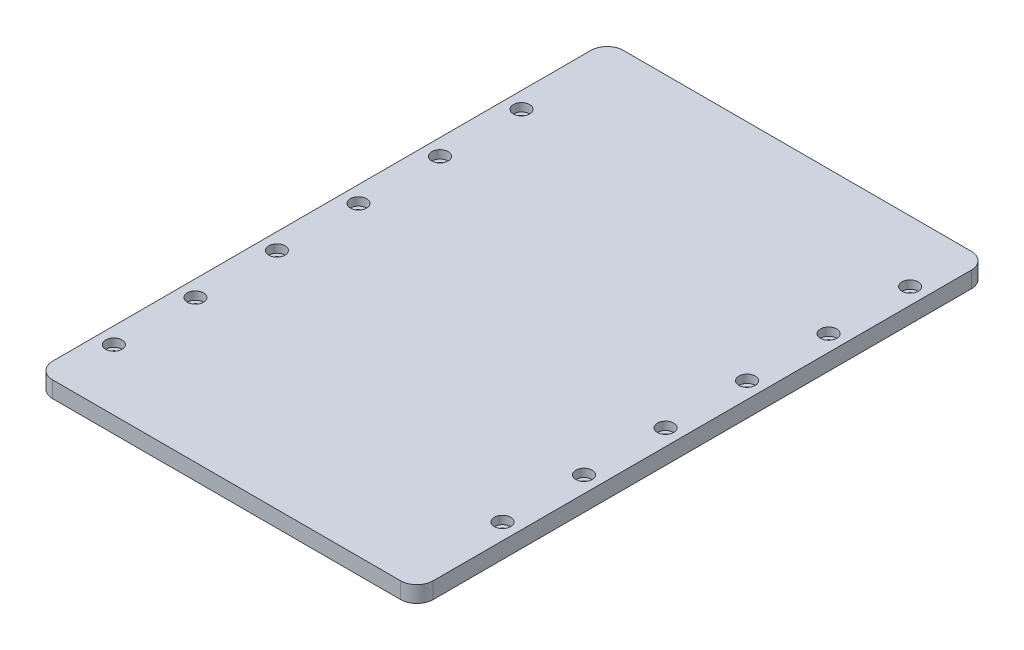
ISO-10303-21;
HEADER;
FILE_DESCRIPTION(('STEP AP214'),'2;1');
FILE_NAME('part.step','',(''),(''),'','','');
FILE_SCHEMA(('AUTOMOTIVE_DESIGN { 1 0 10303 214 1 1 1 1 }'));
ENDSEC;
DATA;
#1=APPLICATION_CONTEXT('core data for automotive mechanical design processes');
#2=APPLICATION_PROTOCOL_DEFINITION('international standard','automotive_design',2000,#1);
#3=PRODUCT_CONTEXT('',#1,'mechanical');
#4=PRODUCT('Part','Part','',(#3));
#5=PRODUCT_RELATED_PRODUCT_CATEGORY('part','',(#4));
#6=PRODUCT_DEFINITION_FORMATION('','',#4);
#7=PRODUCT_DEFINITION_CONTEXT('part definition',#1,'design');
#8=PRODUCT_DEFINITION('design','',#6,#7);
#9=PRODUCT_DEFINITION_SHAPE('','',#8);
#10=(LENGTH_UNIT() NAMED_UNIT(*) SI_UNIT(.MILLI.,.METRE.));
#11=(NAMED_UNIT(*) PLANE_ANGLE_UNIT() SI_UNIT($,.RADIAN.));
#12=(NAMED_UNIT(*) SI_UNIT($,.STERADIAN.) SOLID_ANGLE_UNIT());
#13=UNCERTAINTY_MEASURE_WITH_UNIT(LENGTH_MEASURE(1.E-05),#10,'distance_accuracy_value','');
#14=(GEOMETRIC_REPRESENTATION_CONTEXT(3) GLOBAL_UNCERTAINTY_ASSIGNED_CONTEXT((#13)) GLOBAL_UNIT_ASSIGNED_CONTEXT((#10,
#11,#12)) REPRESENTATION_CONTEXT('',''));
#15=CARTESIAN_POINT('',(0.,0.,0.));
#16=DIRECTION('',(0.,0.,1.));
#17=DIRECTION('',(1.,0.,0.));
#18=AXIS2_PLACEMENT_3D('',#15,#16,#17);
#19=CARTESIAN_POINT('',(63.9999999999998,-4.,7.49999999999999));
#20=DIRECTION('',(0.,1.,0.));
#21=DIRECTION('',(0.,0.,1.));
#22=AXIS2_PLACEMENT_3D('',#19,#20,#21);
#23=CYLINDRICAL_SURFACE('',#22,1.5);
#24=CARTESIAN_POINT('',(63.9999999999998,0.,7.49999999999999));
#25=DIRECTION('',(0.,1.,0.));
#26=DIRECTION('',(0.,0.,1.));
#27=AXIS2_PLACEMENT_3D('',#24,#25,#26);
#28=CIRCLE('',#27,1.5);
#29=CARTESIAN_POINT('',(63.9999999999998,0.,8.99999999999999));
#30=VERTEX_POINT('',#29);
#31=EDGE_CURVE('E162',#30,#30,#28,.T.);
#32=ORIENTED_EDGE('',*,*,#31,.F.);
#33=EDGE_LOOP('',(#32));
#34=FACE_BOUND('',#33,.T.);
#35=CARTESIAN_POINT('',(63.9999999999998,3.,7.49999999999999));
#36=DIRECTION('',(0.,1.,0.));
#37=DIRECTION('',(0.,0.,1.));
#38=AXIS2_PLACEMENT_3D('',#35,#36,#37);
#39=CIRCLE('',#38,1.5);
#40=CARTESIAN_POINT('',(63.9999999999998,3.,8.99999999999999));
#41=VERTEX_POINT('',#40);
#42=EDGE_CURVE('E351',#41,#41,#39,.T.);
#43=ORIENTED_EDGE('',*,*,#42,.T.);
#44=EDGE_LOOP('',(#43));
#45=FACE_BOUND('',#44,.T.);
#46=ADVANCED_FACE('F36',(#34,#45),#23,.F.);
#47=CARTESIAN_POINT('',(63.9999999999999,-4.,37.5));
#48=DIRECTION('',(0.,1.,0.));
#49=DIRECTION('',(0.,0.,1.));
#50=AXIS2_PLACEMENT_3D('',#47,#48,#49);
#51=CYLINDRICAL_SURFACE('',#50,1.5);
#52=CARTESIAN_POINT('',(63.9999999999999,0.,37.5));
#53=DIRECTION('',(0.,1.,0.));
#54=DIRECTION('',(0.,0.,1.));
#55=AXIS2_PLACEMENT_3D('',#52,#53,#54);
#56=CIRCLE('',#55,1.5);
#57=CARTESIAN_POINT('',(63.9999999999999,0.,39.));
#58=VERTEX_POINT('',#57);
#59=EDGE_CURVE('E165',#58,#58,#56,.T.);
#60=ORIENTED_EDGE('',*,*,#59,.F.);
#61=EDGE_LOOP('',(#60));
#62=FACE_BOUND('',#61,.T.);
#63=CARTESIAN_POINT('',(63.9999999999999,3.,37.5));
#64=DIRECTION('',(0.,1.,0.));
#65=DIRECTION('',(0.,0.,1.));
#66=AXIS2_PLACEMENT_3D('',#63,#64,#65);
#67=CIRCLE('',#66,1.5);
#68=CARTESIAN_POINT('',(63.9999999999999,3.,39.));
#69=VERTEX_POINT('',#68);
#70=EDGE_CURVE('E354',#69,#69,#67,.T.);
#71=ORIENTED_EDGE('',*,*,#70,.T.);
#72=EDGE_LOOP('',(#71));
#73=FACE_BOUND('',#72,.T.);
#74=ADVANCED_FACE('F218',(#62,#73),#51,.F.);
#75=CARTESIAN_POINT('',(-64.0000000000005,-4.,-67.5));
#76=DIRECTION('',(0.,1.,0.));
#77=DIRECTION('',(0.,0.,1.));
#78=AXIS2_PLACEMENT_3D('',#75,#76,#77);
#79=CYLINDRICAL_SURFACE('',#78,1.5);
#80=CARTESIAN_POINT('',(-64.0000000000005,0.,-67.5));
#81=DIRECTION('',(0.,1.,0.));
#82=DIRECTION('',(0.,0.,1.));
#83=AXIS2_PLACEMENT_3D('',#80,#81,#82);
#84=CIRCLE('',#83,1.5);
#85=CARTESIAN_POINT('',(-64.0000000000005,0.,-66.));
#86=VERTEX_POINT('',#85);
#87=EDGE_CURVE('E168',#86,#86,#84,.T.);
#88=ORIENTED_EDGE('',*,*,#87,.F.);
#89=EDGE_LOOP('',(#88));
#90=FACE_BOUND('',#89,.T.);
#91=CARTESIAN_POINT('',(-64.0000000000005,3.,-67.5));
#92=DIRECTION('',(0.,1.,0.));
#93=DIRECTION('',(0.,0.,1.));
#94=AXIS2_PLACEMENT_3D('',#91,#92,#93);
#95=CIRCLE('',#94,1.5);
#96=CARTESIAN_POINT('',(-64.0000000000005,3.,-66.));
#97=VERTEX_POINT('',#96);
#98=EDGE_CURVE('E40',#97,#97,#95,.F.);
#99=ORIENTED_EDGE('',*,*,#98,.F.);
#100=EDGE_LOOP('',(#99));
#101=FACE_BOUND('',#100,.T.);
#102=ADVANCED_FACE('F215',(#90,#101),#79,.F.);
#103=CARTESIAN_POINT('',(-64.0000000000004,-4.,-37.5));
#104=DIRECTION('',(0.,1.,0.));
#105=DIRECTION('',(0.,0.,1.));
#106=AXIS2_PLACEMENT_3D('',#103,#104,#105);
#107=CYLINDRICAL_SURFACE('',#106,1.5);
#108=CARTESIAN_POINT('',(-64.0000000000004,0.,-37.5));
#109=DIRECTION('',(0.,1.,0.));
#110=DIRECTION('',(0.,0.,1.));
#111=AXIS2_PLACEMENT_3D('',#108,#109,#110);
#112=CIRCLE('',#111,1.5);
#113=CARTESIAN_POINT('',(-64.0000000000004,0.,-36.));
#114=VERTEX_POINT('',#113);
#115=EDGE_CURVE('E171',#114,#114,#112,.T.);
#116=ORIENTED_EDGE('',*,*,#115,.F.);
#117=EDGE_LOOP('',(#116));
#118=FACE_BOUND('',#117,.T.);
#119=CARTESIAN_POINT('',(-64.0000000000004,3.,-37.5));
#120=DIRECTION('',(0.,1.,0.));
#121=DIRECTION('',(0.,0.,1.));
#122=AXIS2_PLACEMENT_3D('',#119,#120,#121);
#123=CIRCLE('',#122,1.5);
#124=CARTESIAN_POINT('',(-64.0000000000004,3.,-36.));
#125=VERTEX_POINT('',#124);
#126=EDGE_CURVE('E206',#125,#125,#123,.F.);
#127=ORIENTED_EDGE('',*,*,#126,.F.);
#128=EDGE_LOOP('',(#127));
#129=FACE_BOUND('',#128,.T.);
#130=ADVANCED_FACE('F217',(#118,#129),#107,.F.);
#131=CARTESIAN_POINT('',(-64.0000000000003,-4.,-7.50000000000001));
#132=DIRECTION('',(0.,1.,0.));
#133=DIRECTION('',(0.,0.,1.));
#134=AXIS2_PLACEMENT_3D('',#131,#132,#133);
#135=CYLINDRICAL_SURFACE('',#134,1.5);
#136=CARTESIAN_POINT('',(-64.0000000000003,0.,-7.50000000000001));
#137=DIRECTION('',(0.,1.,0.));
#138=DIRECTION('',(0.,0.,1.));
#139=AXIS2_PLACEMENT_3D('',#136,#137,#138);
#140=CIRCLE('',#139,1.5);
#141=CARTESIAN_POINT('',(-64.0000000000003,0.,-6.00000000000001));
#142=VERTEX_POINT('',#141);
#143=EDGE_CURVE('E174',#142,#142,#140,.T.);
#144=ORIENTED_EDGE('',*,*,#143,.F.);
#145=EDGE_LOOP('',(#144));
#146=FACE_BOUND('',#145,.T.);
#147=CARTESIAN_POINT('',(-64.0000000000003,3.,-7.50000000000001));
#148=DIRECTION('',(0.,1.,0.));
#149=DIRECTION('',(0.,0.,1.));
#150=AXIS2_PLACEMENT_3D('',#147,#148,#149);
#151=CIRCLE('',#150,1.5);
#152=CARTESIAN_POINT('',(-64.0000000000003,3.,-6.00000000000001));
#153=VERTEX_POINT('',#152);
#154=EDGE_CURVE('E204',#153,#153,#151,.F.);
#155=ORIENTED_EDGE('',*,*,#154,.F.);
#156=EDGE_LOOP('',(#155));
#157=FACE_BOUND('',#156,.T.);
#158=ADVANCED_FACE('F225',(#146,#157),#135,.F.);
#159=CARTESIAN_POINT('',(-64.0000000000002,-4.,22.5));
#160=DIRECTION('',(0.,1.,0.));
#161=DIRECTION('',(0.,0.,1.));
#162=AXIS2_PLACEMENT_3D('',#159,#160,#161);
#163=CYLINDRICAL_SURFACE('',#162,1.5);
#164=CARTESIAN_POINT('',(-64.0000000000002,0.,22.5));
#165=DIRECTION('',(0.,1.,0.));
#166=DIRECTION('',(0.,0.,1.));
#167=AXIS2_PLACEMENT_3D('',#164,#165,#166);
#168=CIRCLE('',#167,1.5);
#169=CARTESIAN_POINT('',(-64.0000000000002,0.,24.));
#170=VERTEX_POINT('',#169);
#171=EDGE_CURVE('E177',#170,#170,#168,.T.);
#172=ORIENTED_EDGE('',*,*,#171,.F.);
#173=EDGE_LOOP('',(#172));
#174=FACE_BOUND('',#173,.T.);
#175=CARTESIAN_POINT('',(-64.0000000000002,3.,22.5));
#176=DIRECTION('',(0.,1.,0.));
#177=DIRECTION('',(0.,0.,1.));
#178=AXIS2_PLACEMENT_3D('',#175,#176,#177);
#179=CIRCLE('',#178,1.5);
#180=CARTESIAN_POINT('',(-64.0000000000002,3.,24.));
#181=VERTEX_POINT('',#180);
#182=EDGE_CURVE('E200',#181,#181,#179,.F.);
#183=ORIENTED_EDGE('',*,*,#182,.F.);
#184=EDGE_LOOP('',(#183));
#185=FACE_BOUND('',#184,.T.);
#186=ADVANCED_FACE('F248',(#174,#185),#163,.F.);
#187=CARTESIAN_POINT('',(-64.0000000000001,-4.,52.5));
#188=DIRECTION('',(0.,1.,0.));
#189=DIRECTION('',(0.,0.,1.));
#190=AXIS2_PLACEMENT_3D('',#187,#188,#189);
#191=CYLINDRICAL_SURFACE('',#190,1.5);
#192=CARTESIAN_POINT('',(-64.0000000000001,0.,52.5));
#193=DIRECTION('',(0.,1.,0.));
#194=DIRECTION('',(0.,0.,1.));
#195=AXIS2_PLACEMENT_3D('',#192,#193,#194);
#196=CIRCLE('',#195,1.5);
#197=CARTESIAN_POINT('',(-64.0000000000001,0.,54.));
#198=VERTEX_POINT('',#197);
#199=EDGE_CURVE('E180',#198,#198,#196,.T.);
#200=ORIENTED_EDGE('',*,*,#199,.F.);
#201=EDGE_LOOP('',(#200));
#202=FACE_BOUND('',#201,.T.);
#203=CARTESIAN_POINT('',(-64.0000000000001,3.,52.5));
#204=DIRECTION('',(0.,1.,0.));
#205=DIRECTION('',(0.,0.,1.));
#206=AXIS2_PLACEMENT_3D('',#203,#204,#205);
#207=CIRCLE('',#206,1.5);
#208=CARTESIAN_POINT('',(-64.0000000000001,3.,54.));
#209=VERTEX_POINT('',#208);
#210=EDGE_CURVE('E197',#209,#209,#207,.F.);
#211=ORIENTED_EDGE('',*,*,#210,.F.);
#212=EDGE_LOOP('',(#211));
#213=FACE_BOUND('',#212,.T.);
#214=ADVANCED_FACE('F244',(#202,#213),#191,.F.);
#215=CARTESIAN_POINT('',(64.,-4.,67.5));
#216=DIRECTION('',(0.,1.,0.));
#217=DIRECTION('',(0.,0.,1.));
#218=AXIS2_PLACEMENT_3D('',#215,#216,#217);
#219=CYLINDRICAL_SURFACE('',#218,1.5);
#220=CARTESIAN_POINT('',(64.,0.,67.5));
#221=DIRECTION('',(0.,1.,0.));
#222=DIRECTION('',(0.,0.,1.));
#223=AXIS2_PLACEMENT_3D('',#220,#221,#222);
#224=CIRCLE('',#223,1.5);
#225=CARTESIAN_POINT('',(64.,0.,69.));
#226=VERTEX_POINT('',#225);
#227=EDGE_CURVE('E183',#226,#226,#224,.T.);
#228=ORIENTED_EDGE('',*,*,#227,.F.);
#229=EDGE_LOOP('',(#228));
#230=FACE_BOUND('',#229,.T.);
#231=CARTESIAN_POINT('',(64.,3.,67.5));
#232=DIRECTION('',(0.,1.,0.));
#233=DIRECTION('',(0.,0.,1.));
#234=AXIS2_PLACEMENT_3D('',#231,#232,#233);
#235=CIRCLE('',#234,1.5);
#236=CARTESIAN_POINT('',(64.,3.,69.));
#237=VERTEX_POINT('',#236);
#238=EDGE_CURVE('E336',#237,#237,#235,.T.);
#239=ORIENTED_EDGE('',*,*,#238,.T.);
#240=EDGE_LOOP('',(#239));
#241=FACE_BOUND('',#240,.T.);
#242=ADVANCED_FACE('F240',(#230,#241),#219,.F.);
#243=CARTESIAN_POINT('',(63.9999999999997,-4.,-22.5));
#244=DIRECTION('',(0.,1.,0.));
#245=DIRECTION('',(0.,0.,1.));
#246=AXIS2_PLACEMENT_3D('',#243,#244,#245);
#247=CYLINDRICAL_SURFACE('',#246,1.5);
#248=CARTESIAN_POINT('',(63.9999999999997,0.,-22.5));
#249=DIRECTION('',(0.,1.,0.));
#250=DIRECTION('',(0.,0.,1.));
#251=AXIS2_PLACEMENT_3D('',#248,#249,#250);
#252=CIRCLE('',#251,1.5);
#253=CARTESIAN_POINT('',(63.9999999999997,0.,-21.));
#254=VERTEX_POINT('',#253);
#255=EDGE_CURVE('E186',#254,#254,#252,.T.);
#256=ORIENTED_EDGE('',*,*,#255,.F.);
#257=EDGE_LOOP('',(#256));
#258=FACE_BOUND('',#257,.T.);
#259=CARTESIAN_POINT('',(63.9999999999997,3.,-22.5));
#260=DIRECTION('',(0.,1.,0.));
#261=DIRECTION('',(0.,0.,1.));
#262=AXIS2_PLACEMENT_3D('',#259,#260,#261);
#263=CIRCLE('',#262,1.5);
#264=CARTESIAN_POINT('',(63.9999999999997,3.,-21.));
#265=VERTEX_POINT('',#264);
#266=EDGE_CURVE('E381',#265,#265,#263,.T.);
#267=ORIENTED_EDGE('',*,*,#266,.T.);
#268=EDGE_LOOP('',(#267));
#269=FACE_BOUND('',#268,.T.);
#270=ADVANCED_FACE('F243',(#258,#269),#247,.F.);
#271=CARTESIAN_POINT('',(63.9999999999996,-4.,-52.5));
#272=DIRECTION('',(0.,1.,0.));
#273=DIRECTION('',(0.,0.,1.));
#274=AXIS2_PLACEMENT_3D('',#271,#272,#273);
#275=CYLINDRICAL_SURFACE('',#274,1.5);
#276=CARTESIAN_POINT('',(63.9999999999996,0.,-52.5));
#277=DIRECTION('',(0.,1.,0.));
#278=DIRECTION('',(0.,0.,1.));
#279=AXIS2_PLACEMENT_3D('',#276,#277,#278);
#280=CIRCLE('',#279,1.5);
#281=CARTESIAN_POINT('',(63.9999999999996,0.,-51.));
#282=VERTEX_POINT('',#281);
#283=EDGE_CURVE('E189',#282,#282,#280,.T.);
#284=ORIENTED_EDGE('',*,*,#283,.F.);
#285=EDGE_LOOP('',(#284));
#286=FACE_BOUND('',#285,.T.);
#287=CARTESIAN_POINT('',(63.9999999999996,3.,-52.5));
#288=DIRECTION('',(0.,1.,0.));
#289=DIRECTION('',(0.,0.,1.));
#290=AXIS2_PLACEMENT_3D('',#287,#288,#289);
#291=CIRCLE('',#290,1.5);
#292=CARTESIAN_POINT('',(63.9999999999996,3.,-51.));
#293=VERTEX_POINT('',#292);
#294=EDGE_CURVE('E372',#293,#293,#291,.T.);
#295=ORIENTED_EDGE('',*,*,#294,.T.);
#296=EDGE_LOOP('',(#295));
#297=FACE_BOUND('',#296,.T.);
#298=ADVANCED_FACE('F498',(#286,#297),#275,.F.);
#299=CARTESIAN_POINT('',(63.9999999999995,-4.,-82.5));
#300=DIRECTION('',(0.,1.,0.));
#301=DIRECTION('',(0.,0.,1.));
#302=AXIS2_PLACEMENT_3D('',#299,#300,#301);
#303=CYLINDRICAL_SURFACE('',#302,1.5);
#304=CARTESIAN_POINT('',(63.9999999999995,0.,-82.5));
#305=DIRECTION('',(0.,1.,0.));
#306=DIRECTION('',(0.,0.,1.));
#307=AXIS2_PLACEMENT_3D('',#304,#305,#306);
#308=CIRCLE('',#307,1.5);
#309=CARTESIAN_POINT('',(63.9999999999995,0.,-81.));
#310=VERTEX_POINT('',#309);
#311=EDGE_CURVE('E192',#310,#310,#308,.T.);
#312=ORIENTED_EDGE('',*,*,#311,.F.);
#313=EDGE_LOOP('',(#312));
#314=FACE_BOUND('',#313,.T.);
#315=CARTESIAN_POINT('',(63.9999999999995,3.,-82.5));
#316=DIRECTION('',(0.,1.,0.));
#317=DIRECTION('',(0.,0.,1.));
#318=AXIS2_PLACEMENT_3D('',#315,#316,#317);
#319=CIRCLE('',#318,1.5);
#320=CARTESIAN_POINT('',(63.9999999999995,3.,-81.));
#321=VERTEX_POINT('',#320);
#322=EDGE_CURVE('E369',#321,#321,#319,.T.);
#323=ORIENTED_EDGE('',*,*,#322,.T.);
#324=EDGE_LOOP('',(#323));
#325=FACE_BOUND('',#324,.T.);
#326=ADVANCED_FACE('F494',(#314,#325),#303,.F.);
#327=CARTESIAN_POINT('',(-64.,-4.,82.5));
#328=DIRECTION('',(0.,1.,0.));
#329=DIRECTION('',(0.,0.,1.));
#330=AXIS2_PLACEMENT_3D('',#327,#328,#329);
#331=CYLINDRICAL_SURFACE('',#330,1.5);
#332=CARTESIAN_POINT('',(-64.,0.,82.5));
#333=DIRECTION('',(0.,1.,0.));
#334=DIRECTION('',(0.,0.,1.));
#335=AXIS2_PLACEMENT_3D('',#332,#333,#334);
#336=CIRCLE('',#335,1.5);
#337=CARTESIAN_POINT('',(-64.,0.,84.));
#338=VERTEX_POINT('',#337);
#339=EDGE_CURVE('E139',#338,#338,#336,.T.);
#340=ORIENTED_EDGE('',*,*,#339,.F.);
#341=EDGE_LOOP('',(#340));
#342=FACE_BOUND('',#341,.T.);
#343=CARTESIAN_POINT('',(-64.,3.,82.5));
#344=DIRECTION('',(0.,1.,0.));
#345=DIRECTION('',(0.,0.,1.));
#346=AXIS2_PLACEMENT_3D('',#343,#344,#345);
#347=CIRCLE('',#346,1.5);
#348=CARTESIAN_POINT('',(-64.,3.,84.));
#349=VERTEX_POINT('',#348);
#350=EDGE_CURVE('E331',#349,#349,#347,.T.);
#351=ORIENTED_EDGE('',*,*,#350,.T.);
#352=EDGE_LOOP('',(#351));
#353=FACE_BOUND('',#352,.T.);
#354=ADVANCED_FACE('F287',(#342,#353),#331,.F.);
#355=CARTESIAN_POINT('',(64.,6.,99.));
#356=DIRECTION('',(0.,-1.,0.));
#357=DIRECTION('',(0.,0.,-1.));
#358=AXIS2_PLACEMENT_3D('',#355,#356,#357);
#359=CYLINDRICAL_SURFACE('',#358,6.00000000000001);
#360=CARTESIAN_POINT('',(64.,0.,99.));
#361=DIRECTION('',(0.,1.,0.));
#362=DIRECTION('',(0.,0.,1.));
#363=AXIS2_PLACEMENT_3D('',#360,#361,#362);
#364=CIRCLE('',#363,6.00000000000001);
#365=CARTESIAN_POINT('',(64.,0.,105.));
#366=VERTEX_POINT('',#365);
#367=CARTESIAN_POINT('',(70.,0.,99.));
#368=VERTEX_POINT('',#367);
#369=EDGE_CURVE('E135',#366,#368,#364,.T.);
#370=ORIENTED_EDGE('',*,*,#369,.T.);
#371=DIRECTION('',(0.,-1.,0.));
#372=VECTOR('',#371,1.);
#373=CARTESIAN_POINT('',(70.,6.,99.));
#374=LINE('',#373,#372);
#375=CARTESIAN_POINT('',(70.,6.,99.));
#376=VERTEX_POINT('',#375);
#377=EDGE_CURVE('E11',#376,#368,#374,.T.);
#378=ORIENTED_EDGE('',*,*,#377,.F.);
#379=CARTESIAN_POINT('',(64.,6.,99.));
#380=DIRECTION('',(0.,1.,0.));
#381=DIRECTION('',(0.,0.,1.));
#382=AXIS2_PLACEMENT_3D('',#379,#380,#381);
#383=CIRCLE('',#382,6.00000000000001);
#384=CARTESIAN_POINT('',(64.,6.,105.));
#385=VERTEX_POINT('',#384);
#386=EDGE_CURVE('E150',#385,#376,#383,.T.);
#387=ORIENTED_EDGE('',*,*,#386,.F.);
#388=DIRECTION('',(0.,-1.,0.));
#389=VECTOR('',#388,1.);
#390=CARTESIAN_POINT('',(64.,6.,105.));
#391=LINE('',#390,#389);
#392=EDGE_CURVE('E131',#385,#366,#391,.T.);
#393=ORIENTED_EDGE('',*,*,#392,.T.);
#394=EDGE_LOOP('',(#370,#378,#387,#393));
#395=FACE_BOUND('',#394,.T.);
#396=ADVANCED_FACE('F38',(#395),#359,.T.);
#397=CARTESIAN_POINT('',(70.,6.,99.));
#398=DIRECTION('',(-1.,0.,0.));
#399=DIRECTION('',(0.,0.,1.));
#400=AXIS2_PLACEMENT_3D('',#397,#398,#399);
#401=PLANE('',#400);
#402=DIRECTION('',(0.,0.,-1.));
#403=VECTOR('',#402,1.);
#404=CARTESIAN_POINT('',(70.,0.,99.));
#405=LINE('',#404,#403);
#406=CARTESIAN_POINT('',(70.,0.,-99.));
#407=VERTEX_POINT('',#406);
#408=EDGE_CURVE('E138',#368,#407,#405,.T.);
#409=ORIENTED_EDGE('',*,*,#408,.T.);
#410=DIRECTION('',(0.,-1.,0.));
#411=VECTOR('',#410,1.);
#412=CARTESIAN_POINT('',(70.,6.,-99.));
#413=LINE('',#412,#411);
#414=CARTESIAN_POINT('',(70.,6.,-99.));
#415=VERTEX_POINT('',#414);
#416=EDGE_CURVE('E46',#415,#407,#413,.T.);
#417=ORIENTED_EDGE('',*,*,#416,.F.);
#418=DIRECTION('',(0.,0.,-1.));
#419=VECTOR('',#418,1.);
#420=CARTESIAN_POINT('',(70.,6.,99.));
#421=LINE('',#420,#419);
#422=EDGE_CURVE('E98',#376,#415,#421,.T.);
#423=ORIENTED_EDGE('',*,*,#422,.F.);
#424=ORIENTED_EDGE('',*,*,#377,.T.);
#425=EDGE_LOOP('',(#409,#417,#423,#424));
#426=FACE_BOUND('',#425,.T.);
#427=ADVANCED_FACE('F281',(#426),#401,.F.);
#428=CARTESIAN_POINT('',(64.,6.,-99.));
#429=DIRECTION('',(0.,-1.,0.));
#430=DIRECTION('',(0.,0.,-1.));
#431=AXIS2_PLACEMENT_3D('',#428,#429,#430);
#432=CYLINDRICAL_SURFACE('',#431,6.00000000000001);
#433=CARTESIAN_POINT('',(64.,0.,-99.));
#434=DIRECTION('',(0.,1.,0.));
#435=DIRECTION('',(0.,0.,1.));
#436=AXIS2_PLACEMENT_3D('',#433,#434,#435);
#437=CIRCLE('',#436,6.00000000000001);
#438=CARTESIAN_POINT('',(64.,0.,-105.));
#439=VERTEX_POINT('',#438);
#440=EDGE_CURVE('E141',#407,#439,#437,.T.);
#441=ORIENTED_EDGE('',*,*,#440,.T.);
#442=DIRECTION('',(0.,-1.,0.));
#443=VECTOR('',#442,1.);
#444=CARTESIAN_POINT('',(64.,6.,-105.));
#445=LINE('',#444,#443);
#446=CARTESIAN_POINT('',(64.,6.,-105.));
#447=VERTEX_POINT('',#446);
#448=EDGE_CURVE('E157',#447,#439,#445,.T.);
#449=ORIENTED_EDGE('',*,*,#448,.F.);
#450=CARTESIAN_POINT('',(64.,6.,-99.));
#451=DIRECTION('',(0.,1.,0.));
#452=DIRECTION('',(0.,0.,1.));
#453=AXIS2_PLACEMENT_3D('',#450,#451,#452);
#454=CIRCLE('',#453,6.00000000000001);
#455=EDGE_CURVE('E295',#415,#447,#454,.T.);
#456=ORIENTED_EDGE('',*,*,#455,.F.);
#457=ORIENTED_EDGE('',*,*,#416,.T.);
#458=EDGE_LOOP('',(#441,#449,#456,#457));
#459=FACE_BOUND('',#458,.T.);
#460=ADVANCED_FACE('F278',(#459),#432,.T.);
#461=CARTESIAN_POINT('',(64.,6.,-105.));
#462=DIRECTION('',(0.,0.,1.));
#463=DIRECTION('',(1.,0.,0.));
#464=AXIS2_PLACEMENT_3D('',#461,#462,#463);
#465=PLANE('',#464);
#466=DIRECTION('',(-1.,0.,0.));
#467=VECTOR('',#466,1.);
#468=CARTESIAN_POINT('',(64.,0.,-105.));
#469=LINE('',#468,#467);
#470=CARTESIAN_POINT('',(-64.,0.,-105.));
#471=VERTEX_POINT('',#470);
#472=EDGE_CURVE('E143',#439,#471,#469,.T.);
#473=ORIENTED_EDGE('',*,*,#472,.T.);
#474=DIRECTION('',(0.,-1.,0.));
#475=VECTOR('',#474,1.);
#476=CARTESIAN_POINT('',(-64.,6.,-105.));
#477=LINE('',#476,#475);
#478=CARTESIAN_POINT('',(-64.,6.,-105.));
#479=VERTEX_POINT('',#478);
#480=EDGE_CURVE('E154',#479,#471,#477,.T.);
#481=ORIENTED_EDGE('',*,*,#480,.F.);
#482=DIRECTION('',(-1.,0.,0.));
#483=VECTOR('',#482,1.);
#484=CARTESIAN_POINT('',(64.,6.,-105.));
#485=LINE('',#484,#483);
#486=EDGE_CURVE('E300',#447,#479,#485,.T.);
#487=ORIENTED_EDGE('',*,*,#486,.F.);
#488=ORIENTED_EDGE('',*,*,#448,.T.);
#489=EDGE_LOOP('',(#473,#481,#487,#488));
#490=FACE_BOUND('',#489,.T.);
#491=ADVANCED_FACE('F274',(#490),#465,.F.);
#492=CARTESIAN_POINT('',(-64.,6.,-99.));
#493=DIRECTION('',(0.,-1.,0.));
#494=DIRECTION('',(0.,0.,-1.));
#495=AXIS2_PLACEMENT_3D('',#492,#493,#494);
#496=CYLINDRICAL_SURFACE('',#495,6.00000000000001);
#497=CARTESIAN_POINT('',(-64.,0.,-99.));
#498=DIRECTION('',(0.,1.,0.));
#499=DIRECTION('',(0.,0.,1.));
#500=AXIS2_PLACEMENT_3D('',#497,#498,#499);
#501=CIRCLE('',#500,6.00000000000001);
#502=CARTESIAN_POINT('',(-70.,0.,-99.));
#503=VERTEX_POINT('',#502);
#504=EDGE_CURVE('E145',#471,#503,#501,.T.);
#505=ORIENTED_EDGE('',*,*,#504,.T.);
#506=DIRECTION('',(0.,-1.,0.));
#507=VECTOR('',#506,1.);
#508=CARTESIAN_POINT('',(-70.,6.,-99.));
#509=LINE('',#508,#507);
#510=CARTESIAN_POINT('',(-70.,6.,-99.));
#511=VERTEX_POINT('',#510);
#512=EDGE_CURVE('E126',#511,#503,#509,.T.);
#513=ORIENTED_EDGE('',*,*,#512,.F.);
#514=CARTESIAN_POINT('',(-64.,6.,-99.));
#515=DIRECTION('',(0.,1.,0.));
#516=DIRECTION('',(0.,0.,1.));
#517=AXIS2_PLACEMENT_3D('',#514,#515,#516);
#518=CIRCLE('',#517,6.00000000000001);
#519=EDGE_CURVE('E117',#479,#511,#518,.T.);
#520=ORIENTED_EDGE('',*,*,#519,.F.);
#521=ORIENTED_EDGE('',*,*,#480,.T.);
#522=EDGE_LOOP('',(#505,#513,#520,#521));
#523=FACE_BOUND('',#522,.T.);
#524=ADVANCED_FACE('F271',(#523),#496,.T.);
#525=CARTESIAN_POINT('',(-70.,6.,-99.));
#526=DIRECTION('',(1.,0.,0.));
#527=DIRECTION('',(0.,0.,-1.));
#528=AXIS2_PLACEMENT_3D('',#525,#526,#527);
#529=PLANE('',#528);
#530=DIRECTION('',(0.,0.,1.));
#531=VECTOR('',#530,1.);
#532=CARTESIAN_POINT('',(-70.,0.,-99.));
#533=LINE('',#532,#531);
#534=CARTESIAN_POINT('',(-70.,0.,99.));
#535=VERTEX_POINT('',#534);
#536=EDGE_CURVE('E125',#503,#535,#533,.T.);
#537=ORIENTED_EDGE('',*,*,#536,.T.);
#538=DIRECTION('',(0.,-1.,0.));
#539=VECTOR('',#538,1.);
#540=CARTESIAN_POINT('',(-70.,6.,99.));
#541=LINE('',#540,#539);
#542=CARTESIAN_POINT('',(-70.,6.,99.));
#543=VERTEX_POINT('',#542);
#544=EDGE_CURVE('E122',#543,#535,#541,.T.);
#545=ORIENTED_EDGE('',*,*,#544,.F.);
#546=DIRECTION('',(0.,0.,1.));
#547=VECTOR('',#546,1.);
#548=CARTESIAN_POINT('',(-70.,6.,-99.));
#549=LINE('',#548,#547);
#550=EDGE_CURVE('E111',#511,#543,#549,.T.);
#551=ORIENTED_EDGE('',*,*,#550,.F.);
#552=ORIENTED_EDGE('',*,*,#512,.T.);
#553=EDGE_LOOP('',(#537,#545,#551,#552));
#554=FACE_BOUND('',#553,.T.);
#555=ADVANCED_FACE('F123',(#554),#529,.F.);
#556=CARTESIAN_POINT('',(-64.,6.,99.));
#557=DIRECTION('',(0.,-1.,0.));
#558=DIRECTION('',(0.,0.,-1.));
#559=AXIS2_PLACEMENT_3D('',#556,#557,#558);
#560=CYLINDRICAL_SURFACE('',#559,6.00000000000001);
#561=CARTESIAN_POINT('',(-64.,0.,99.));
#562=DIRECTION('',(0.,1.,0.));
#563=DIRECTION('',(0.,0.,1.));
#564=AXIS2_PLACEMENT_3D('',#561,#562,#563);
#565=CIRCLE('',#564,6.00000000000001);
#566=CARTESIAN_POINT('',(-64.,0.,105.));
#567=VERTEX_POINT('',#566);
#568=EDGE_CURVE('E84',#535,#567,#565,.T.);
#569=ORIENTED_EDGE('',*,*,#568,.T.);
#570=DIRECTION('',(0.,-1.,0.));
#571=VECTOR('',#570,1.);
#572=CARTESIAN_POINT('',(-64.,6.,105.));
#573=LINE('',#572,#571);
#574=CARTESIAN_POINT('',(-64.,6.,105.));
#575=VERTEX_POINT('',#574);
#576=EDGE_CURVE('E127',#575,#567,#573,.T.);
#577=ORIENTED_EDGE('',*,*,#576,.F.);
#578=CARTESIAN_POINT('',(-64.,6.,99.));
#579=DIRECTION('',(0.,1.,0.));
#580=DIRECTION('',(0.,0.,1.));
#581=AXIS2_PLACEMENT_3D('',#578,#579,#580);
#582=CIRCLE('',#581,6.00000000000001);
#583=EDGE_CURVE('E115',#543,#575,#582,.T.);
#584=ORIENTED_EDGE('',*,*,#583,.F.);
#585=ORIENTED_EDGE('',*,*,#544,.T.);
#586=EDGE_LOOP('',(#569,#577,#584,#585));
#587=FACE_BOUND('',#586,.T.);
#588=ADVANCED_FACE('F129',(#587),#560,.T.);
#589=CARTESIAN_POINT('',(-64.,6.,105.));
#590=DIRECTION('',(0.,0.,-1.));
#591=DIRECTION('',(-1.,0.,0.));
#592=AXIS2_PLACEMENT_3D('',#589,#590,#591);
#593=PLANE('',#592);
#594=DIRECTION('',(1.,0.,0.));
#595=VECTOR('',#594,1.);
#596=CARTESIAN_POINT('',(-64.,0.,105.));
#597=LINE('',#596,#595);
#598=EDGE_CURVE('E90',#567,#366,#597,.T.);
#599=ORIENTED_EDGE('',*,*,#598,.T.);
#600=ORIENTED_EDGE('',*,*,#392,.F.);
#601=DIRECTION('',(1.,0.,0.));
#602=VECTOR('',#601,1.);
#603=CARTESIAN_POINT('',(-64.,6.,105.));
#604=LINE('',#603,#602);
#605=EDGE_CURVE('E55',#575,#385,#604,.T.);
#606=ORIENTED_EDGE('',*,*,#605,.F.);
#607=ORIENTED_EDGE('',*,*,#576,.T.);
#608=EDGE_LOOP('',(#599,#600,#606,#607));
#609=FACE_BOUND('',#608,.T.);
#610=ADVANCED_FACE('F259',(#609),#593,.F.);
#611=CARTESIAN_POINT('',(64.,6.,99.));
#612=DIRECTION('',(0.,1.,0.));
#613=DIRECTION('',(0.,0.,1.));
#614=AXIS2_PLACEMENT_3D('',#611,#612,#613);
#615=PLANE('',#614);
#616=CARTESIAN_POINT('',(-64.,6.,82.5));
#617=DIRECTION('',(0.,1.,0.));
#618=DIRECTION('',(0.,0.,1.));
#619=AXIS2_PLACEMENT_3D('',#616,#617,#618);
#620=CIRCLE('',#619,3.);
#621=CARTESIAN_POINT('',(-64.,6.,85.5));
#622=VERTEX_POINT('',#621);
#623=EDGE_CURVE('E391',#622,#622,#620,.T.);
#624=ORIENTED_EDGE('',*,*,#623,.F.);
#625=EDGE_LOOP('',(#624));
#626=FACE_BOUND('',#625,.T.);
#627=CARTESIAN_POINT('',(63.9999999999995,6.,-82.5));
#628=DIRECTION('',(0.,1.,0.));
#629=DIRECTION('',(0.,0.,1.));
#630=AXIS2_PLACEMENT_3D('',#627,#628,#629);
#631=CIRCLE('',#630,3.00000000000001);
#632=CARTESIAN_POINT('',(63.9999999999995,6.,-79.5));
#633=VERTEX_POINT('',#632);
#634=EDGE_CURVE('E365',#633,#633,#631,.T.);
#635=ORIENTED_EDGE('',*,*,#634,.F.);
#636=EDGE_LOOP('',(#635));
#637=FACE_BOUND('',#636,.T.);
#638=CARTESIAN_POINT('',(63.9999999999996,6.,-52.5));
#639=DIRECTION('',(0.,1.,0.));
#640=DIRECTION('',(0.,0.,1.));
#641=AXIS2_PLACEMENT_3D('',#638,#639,#640);
#642=CIRCLE('',#641,3.00000000000001);
#643=CARTESIAN_POINT('',(63.9999999999996,6.,-49.5));
#644=VERTEX_POINT('',#643);
#645=EDGE_CURVE('E375',#644,#644,#642,.T.);
#646=ORIENTED_EDGE('',*,*,#645,.F.);
#647=EDGE_LOOP('',(#646));
#648=FACE_BOUND('',#647,.T.);
#649=CARTESIAN_POINT('',(63.9999999999997,6.,-22.5));
#650=DIRECTION('',(0.,1.,0.));
#651=DIRECTION('',(0.,0.,1.));
#652=AXIS2_PLACEMENT_3D('',#649,#650,#651);
#653=CIRCLE('',#652,3.00000000000001);
#654=CARTESIAN_POINT('',(63.9999999999997,6.,-19.5));
#655=VERTEX_POINT('',#654);
#656=EDGE_CURVE('E384',#655,#655,#653,.T.);
#657=ORIENTED_EDGE('',*,*,#656,.F.);
#658=EDGE_LOOP('',(#657));
#659=FACE_BOUND('',#658,.T.);
#660=CARTESIAN_POINT('',(-64.0000000000001,6.,52.5));
#661=DIRECTION('',(0.,1.,0.));
#662=DIRECTION('',(0.,0.,1.));
#663=AXIS2_PLACEMENT_3D('',#660,#661,#662);
#664=CIRCLE('',#663,2.99999999999999);
#665=CARTESIAN_POINT('',(-64.0000000000001,6.,55.5));
#666=VERTEX_POINT('',#665);
#667=EDGE_CURVE('E325',#666,#666,#664,.T.);
#668=ORIENTED_EDGE('',*,*,#667,.F.);
#669=EDGE_LOOP('',(#668));
#670=FACE_BOUND('',#669,.T.);
#671=CARTESIAN_POINT('',(-64.0000000000002,6.,22.5));
#672=DIRECTION('',(0.,1.,0.));
#673=DIRECTION('',(0.,0.,1.));
#674=AXIS2_PLACEMENT_3D('',#671,#672,#673);
#675=CIRCLE('',#674,3.);
#676=CARTESIAN_POINT('',(-64.0000000000002,6.,25.5));
#677=VERTEX_POINT('',#676);
#678=EDGE_CURVE('E319',#677,#677,#675,.T.);
#679=ORIENTED_EDGE('',*,*,#678,.F.);
#680=EDGE_LOOP('',(#679));
#681=FACE_BOUND('',#680,.T.);
#682=CARTESIAN_POINT('',(-64.0000000000003,6.,-7.50000000000001));
#683=DIRECTION('',(0.,1.,0.));
#684=DIRECTION('',(0.,0.,1.));
#685=AXIS2_PLACEMENT_3D('',#682,#683,#684);
#686=CIRCLE('',#685,3.);
#687=CARTESIAN_POINT('',(-64.0000000000003,6.,-4.5));
#688=VERTEX_POINT('',#687);
#689=EDGE_CURVE('E313',#688,#688,#686,.T.);
#690=ORIENTED_EDGE('',*,*,#689,.F.);
#691=EDGE_LOOP('',(#690));
#692=FACE_BOUND('',#691,.T.);
#693=CARTESIAN_POINT('',(-64.0000000000004,6.,-37.5));
#694=DIRECTION('',(0.,1.,0.));
#695=DIRECTION('',(0.,0.,1.));
#696=AXIS2_PLACEMENT_3D('',#693,#694,#695);
#697=CIRCLE('',#696,3.00000000000001);
#698=CARTESIAN_POINT('',(-64.0000000000004,6.,-34.5));
#699=VERTEX_POINT('',#698);
#700=EDGE_CURVE('E306',#699,#699,#697,.T.);
#701=ORIENTED_EDGE('',*,*,#700,.F.);
#702=EDGE_LOOP('',(#701));
#703=FACE_BOUND('',#702,.T.);
#704=CARTESIAN_POINT('',(63.9999999999998,6.,7.49999999999999));
#705=DIRECTION('',(0.,1.,0.));
#706=DIRECTION('',(0.,0.,1.));
#707=AXIS2_PLACEMENT_3D('',#704,#705,#706);
#708=CIRCLE('',#707,3.00000000000001);
#709=CARTESIAN_POINT('',(63.9999999999998,6.,10.5));
#710=VERTEX_POINT('',#709);
#711=EDGE_CURVE('E347',#710,#710,#708,.T.);
#712=ORIENTED_EDGE('',*,*,#711,.F.);
#713=EDGE_LOOP('',(#712));
#714=FACE_BOUND('',#713,.T.);
#715=CARTESIAN_POINT('',(63.9999999999999,6.,37.5));
#716=DIRECTION('',(0.,1.,0.));
#717=DIRECTION('',(0.,0.,1.));
#718=AXIS2_PLACEMENT_3D('',#715,#716,#717);
#719=CIRCLE('',#718,3.00000000000001);
#720=CARTESIAN_POINT('',(63.9999999999999,6.,40.5));
#721=VERTEX_POINT('',#720);
#722=EDGE_CURVE('E358',#721,#721,#719,.T.);
#723=ORIENTED_EDGE('',*,*,#722,.F.);
#724=EDGE_LOOP('',(#723));
#725=FACE_BOUND('',#724,.T.);
#726=CARTESIAN_POINT('',(64.,6.,67.5));
#727=DIRECTION('',(0.,1.,0.));
#728=DIRECTION('',(0.,0.,1.));
#729=AXIS2_PLACEMENT_3D('',#726,#727,#728);
#730=CIRCLE('',#729,3.00000000000001);
#731=CARTESIAN_POINT('',(64.,6.,70.5));
#732=VERTEX_POINT('',#731);
#733=EDGE_CURVE('E332',#732,#732,#730,.T.);
#734=ORIENTED_EDGE('',*,*,#733,.F.);
#735=EDGE_LOOP('',(#734));
#736=FACE_BOUND('',#735,.T.);
#737=CARTESIAN_POINT('',(-64.0000000000005,6.,-67.5));
#738=DIRECTION('',(0.,1.,0.));
#739=DIRECTION('',(0.,0.,1.));
#740=AXIS2_PLACEMENT_3D('',#737,#738,#739);
#741=CIRCLE('',#740,3.);
#742=CARTESIAN_POINT('',(-64.0000000000005,6.,-64.5));
#743=VERTEX_POINT('',#742);
#744=EDGE_CURVE('E339',#743,#743,#741,.T.);
#745=ORIENTED_EDGE('',*,*,#744,.F.);
#746=EDGE_LOOP('',(#745));
#747=FACE_BOUND('',#746,.T.);
#748=ORIENTED_EDGE('',*,*,#386,.T.);
#749=ORIENTED_EDGE('',*,*,#422,.T.);
#750=ORIENTED_EDGE('',*,*,#455,.T.);
#751=ORIENTED_EDGE('',*,*,#486,.T.);
#752=ORIENTED_EDGE('',*,*,#519,.T.);
#753=ORIENTED_EDGE('',*,*,#550,.T.);
#754=ORIENTED_EDGE('',*,*,#583,.T.);
#755=ORIENTED_EDGE('',*,*,#605,.T.);
#756=EDGE_LOOP('',(#748,#749,#750,#751,#752,#753,#754,#755));
#757=FACE_BOUND('',#756,.T.);
#758=ADVANCED_FACE('F113',(#626,#637,#648,#659,#670,#681,#692,#703,#714,#725,#736,#747,#757),
#615,.T.);
#759=CARTESIAN_POINT('',(64.,0.,99.));
#760=DIRECTION('',(0.,1.,0.));
#761=DIRECTION('',(0.,0.,1.));
#762=AXIS2_PLACEMENT_3D('',#759,#760,#761);
#763=PLANE('',#762);
#764=ORIENTED_EDGE('',*,*,#339,.T.);
#765=EDGE_LOOP('',(#764));
#766=FACE_BOUND('',#765,.T.);
#767=ORIENTED_EDGE('',*,*,#311,.T.);
#768=EDGE_LOOP('',(#767));
#769=FACE_BOUND('',#768,.T.);
#770=ORIENTED_EDGE('',*,*,#283,.T.);
#771=EDGE_LOOP('',(#770));
#772=FACE_BOUND('',#771,.T.);
#773=ORIENTED_EDGE('',*,*,#255,.T.);
#774=EDGE_LOOP('',(#773));
#775=FACE_BOUND('',#774,.T.);
#776=ORIENTED_EDGE('',*,*,#227,.T.);
#777=EDGE_LOOP('',(#776));
#778=FACE_BOUND('',#777,.T.);
#779=ORIENTED_EDGE('',*,*,#199,.T.);
#780=EDGE_LOOP('',(#779));
#781=FACE_BOUND('',#780,.T.);
#782=ORIENTED_EDGE('',*,*,#171,.T.);
#783=EDGE_LOOP('',(#782));
#784=FACE_BOUND('',#783,.T.);
#785=ORIENTED_EDGE('',*,*,#143,.T.);
#786=EDGE_LOOP('',(#785));
#787=FACE_BOUND('',#786,.T.);
#788=ORIENTED_EDGE('',*,*,#115,.T.);
#789=EDGE_LOOP('',(#788));
#790=FACE_BOUND('',#789,.T.);
#791=ORIENTED_EDGE('',*,*,#87,.T.);
#792=EDGE_LOOP('',(#791));
#793=FACE_BOUND('',#792,.T.);
#794=ORIENTED_EDGE('',*,*,#59,.T.);
#795=EDGE_LOOP('',(#794));
#796=FACE_BOUND('',#795,.T.);
#797=ORIENTED_EDGE('',*,*,#31,.T.);
#798=EDGE_LOOP('',(#797));
#799=FACE_BOUND('',#798,.T.);
#800=ORIENTED_EDGE('',*,*,#369,.F.);
#801=ORIENTED_EDGE('',*,*,#598,.F.);
#802=ORIENTED_EDGE('',*,*,#568,.F.);
#803=ORIENTED_EDGE('',*,*,#536,.F.);
#804=ORIENTED_EDGE('',*,*,#504,.F.);
#805=ORIENTED_EDGE('',*,*,#472,.F.);
#806=ORIENTED_EDGE('',*,*,#440,.F.);
#807=ORIENTED_EDGE('',*,*,#408,.F.);
#808=EDGE_LOOP('',(#800,#801,#802,#803,#804,#805,#806,#807));
#809=FACE_BOUND('',#808,.T.);
#810=ADVANCED_FACE('F258',(#766,#769,#772,#775,#778,#781,#784,#787,#790,#793,#796,#799,#809),
#763,.F.);
#811=CARTESIAN_POINT('',(-64.,3.,82.5));
#812=DIRECTION('',(0.,1.,0.));
#813=DIRECTION('',(0.,0.,1.));
#814=AXIS2_PLACEMENT_3D('',#811,#812,#813);
#815=CYLINDRICAL_SURFACE('',#814,3.);
#816=CARTESIAN_POINT('',(-64.,3.,82.5));
#817=DIRECTION('',(0.,1.,0.));
#818=DIRECTION('',(0.,0.,1.));
#819=AXIS2_PLACEMENT_3D('',#816,#817,#818);
#820=CIRCLE('',#819,3.);
#821=CARTESIAN_POINT('',(-64.,3.,85.5));
#822=VERTEX_POINT('',#821);
#823=EDGE_CURVE('E201',#822,#822,#820,.T.);
#824=ORIENTED_EDGE('',*,*,#823,.F.);
#825=EDGE_LOOP('',(#824));
#826=FACE_BOUND('',#825,.T.);
#827=ORIENTED_EDGE('',*,*,#623,.T.);
#828=EDGE_LOOP('',(#827));
#829=FACE_BOUND('',#828,.T.);
#830=ADVANCED_FACE('F263',(#826,#829),#815,.F.);
#831=CARTESIAN_POINT('',(-64.,3.,82.5));
#832=DIRECTION('',(0.,1.,0.));
#833=DIRECTION('',(0.,0.,1.));
#834=AXIS2_PLACEMENT_3D('',#831,#832,#833);
#835=PLANE('',#834);
#836=ORIENTED_EDGE('',*,*,#350,.F.);
#837=EDGE_LOOP('',(#836));
#838=FACE_BOUND('',#837,.T.);
#839=ORIENTED_EDGE('',*,*,#823,.T.);
#840=EDGE_LOOP('',(#839));
#841=FACE_BOUND('',#840,.T.);
#842=ADVANCED_FACE('F400',(#838,#841),#835,.T.);
#843=CARTESIAN_POINT('',(63.9999999999995,3.,-82.5));
#844=DIRECTION('',(0.,1.,0.));
#845=DIRECTION('',(0.,0.,1.));
#846=AXIS2_PLACEMENT_3D('',#843,#844,#845);
#847=CYLINDRICAL_SURFACE('',#846,3.00000000000001);
#848=CARTESIAN_POINT('',(63.9999999999995,3.,-82.5));
#849=DIRECTION('',(0.,1.,0.));
#850=DIRECTION('',(0.,0.,1.));
#851=AXIS2_PLACEMENT_3D('',#848,#849,#850);
#852=CIRCLE('',#851,3.00000000000001);
#853=CARTESIAN_POINT('',(63.9999999999995,3.,-79.5));
#854=VERTEX_POINT('',#853);
#855=EDGE_CURVE('E368',#854,#854,#852,.T.);
#856=ORIENTED_EDGE('',*,*,#855,.F.);
#857=EDGE_LOOP('',(#856));
#858=FACE_BOUND('',#857,.T.);
#859=ORIENTED_EDGE('',*,*,#634,.T.);
#860=EDGE_LOOP('',(#859));
#861=FACE_BOUND('',#860,.T.);
#862=ADVANCED_FACE('F403',(#858,#861),#847,.F.);
#863=CARTESIAN_POINT('',(63.9999999999995,3.,-82.5));
#864=DIRECTION('',(0.,1.,0.));
#865=DIRECTION('',(0.,0.,1.));
#866=AXIS2_PLACEMENT_3D('',#863,#864,#865);
#867=PLANE('',#866);
#868=ORIENTED_EDGE('',*,*,#322,.F.);
#869=EDGE_LOOP('',(#868));
#870=FACE_BOUND('',#869,.T.);
#871=ORIENTED_EDGE('',*,*,#855,.T.);
#872=EDGE_LOOP('',(#871));
#873=FACE_BOUND('',#872,.T.);
#874=ADVANCED_FACE('F511',(#870,#873),#867,.T.);
#875=CARTESIAN_POINT('',(63.9999999999996,3.,-52.5));
#876=DIRECTION('',(0.,1.,0.));
#877=DIRECTION('',(0.,0.,1.));
#878=AXIS2_PLACEMENT_3D('',#875,#876,#877);
#879=CYLINDRICAL_SURFACE('',#878,3.00000000000001);
#880=CARTESIAN_POINT('',(63.9999999999996,3.,-52.5));
#881=DIRECTION('',(0.,1.,0.));
#882=DIRECTION('',(0.,0.,1.));
#883=AXIS2_PLACEMENT_3D('',#880,#881,#882);
#884=CIRCLE('',#883,3.00000000000001);
#885=CARTESIAN_POINT('',(63.9999999999996,3.,-49.5));
#886=VERTEX_POINT('',#885);
#887=EDGE_CURVE('E378',#886,#886,#884,.T.);
#888=ORIENTED_EDGE('',*,*,#887,.F.);
#889=EDGE_LOOP('',(#888));
#890=FACE_BOUND('',#889,.T.);
#891=ORIENTED_EDGE('',*,*,#645,.T.);
#892=EDGE_LOOP('',(#891));
#893=FACE_BOUND('',#892,.T.);
#894=ADVANCED_FACE('F514',(#890,#893),#879,.F.);
#895=CARTESIAN_POINT('',(63.9999999999996,3.,-52.5));
#896=DIRECTION('',(0.,1.,0.));
#897=DIRECTION('',(0.,0.,1.));
#898=AXIS2_PLACEMENT_3D('',#895,#896,#897);
#899=PLANE('',#898);
#900=ORIENTED_EDGE('',*,*,#294,.F.);
#901=EDGE_LOOP('',(#900));
#902=FACE_BOUND('',#901,.T.);
#903=ORIENTED_EDGE('',*,*,#887,.T.);
#904=EDGE_LOOP('',(#903));
#905=FACE_BOUND('',#904,.T.);
#906=ADVANCED_FACE('F634',(#902,#905),#899,.T.);
#907=CARTESIAN_POINT('',(63.9999999999997,3.,-22.5));
#908=DIRECTION('',(0.,1.,0.));
#909=DIRECTION('',(0.,0.,1.));
#910=AXIS2_PLACEMENT_3D('',#907,#908,#909);
#911=CYLINDRICAL_SURFACE('',#910,3.00000000000001);
#912=CARTESIAN_POINT('',(63.9999999999997,3.,-22.5));
#913=DIRECTION('',(0.,1.,0.));
#914=DIRECTION('',(0.,0.,1.));
#915=AXIS2_PLACEMENT_3D('',#912,#913,#914);
#916=CIRCLE('',#915,3.00000000000001);
#917=CARTESIAN_POINT('',(63.9999999999997,3.,-19.5));
#918=VERTEX_POINT('',#917);
#919=EDGE_CURVE('E357',#918,#918,#916,.T.);
#920=ORIENTED_EDGE('',*,*,#919,.F.);
#921=EDGE_LOOP('',(#920));
#922=FACE_BOUND('',#921,.T.);
#923=ORIENTED_EDGE('',*,*,#656,.T.);
#924=EDGE_LOOP('',(#923));
#925=FACE_BOUND('',#924,.T.);
#926=ADVANCED_FACE('F625',(#922,#925),#911,.F.);
#927=CARTESIAN_POINT('',(63.9999999999997,3.,-22.5));
#928=DIRECTION('',(0.,1.,0.));
#929=DIRECTION('',(0.,0.,1.));
#930=AXIS2_PLACEMENT_3D('',#927,#928,#929);
#931=PLANE('',#930);
#932=ORIENTED_EDGE('',*,*,#266,.F.);
#933=EDGE_LOOP('',(#932));
#934=FACE_BOUND('',#933,.T.);
#935=ORIENTED_EDGE('',*,*,#919,.T.);
#936=EDGE_LOOP('',(#935));
#937=FACE_BOUND('',#936,.T.);
#938=ADVANCED_FACE('F460',(#934,#937),#931,.T.);
#939=CARTESIAN_POINT('',(64.,3.,67.5));
#940=DIRECTION('',(0.,1.,0.));
#941=DIRECTION('',(0.,0.,1.));
#942=AXIS2_PLACEMENT_3D('',#939,#940,#941);
#943=CYLINDRICAL_SURFACE('',#942,3.00000000000001);
#944=CARTESIAN_POINT('',(64.,3.,67.5));
#945=DIRECTION('',(0.,1.,0.));
#946=DIRECTION('',(0.,0.,1.));
#947=AXIS2_PLACEMENT_3D('',#944,#945,#946);
#948=CIRCLE('',#947,3.00000000000001);
#949=CARTESIAN_POINT('',(64.,3.,70.5));
#950=VERTEX_POINT('',#949);
#951=EDGE_CURVE('E335',#950,#950,#948,.T.);
#952=ORIENTED_EDGE('',*,*,#951,.F.);
#953=EDGE_LOOP('',(#952));
#954=FACE_BOUND('',#953,.T.);
#955=ORIENTED_EDGE('',*,*,#733,.T.);
#956=EDGE_LOOP('',(#955));
#957=FACE_BOUND('',#956,.T.);
#958=ADVANCED_FACE('F456',(#954,#957),#943,.F.);
#959=CARTESIAN_POINT('',(64.,3.,67.5));
#960=DIRECTION('',(0.,1.,0.));
#961=DIRECTION('',(0.,0.,1.));
#962=AXIS2_PLACEMENT_3D('',#959,#960,#961);
#963=PLANE('',#962);
#964=ORIENTED_EDGE('',*,*,#238,.F.);
#965=EDGE_LOOP('',(#964));
#966=FACE_BOUND('',#965,.T.);
#967=ORIENTED_EDGE('',*,*,#951,.T.);
#968=EDGE_LOOP('',(#967));
#969=FACE_BOUND('',#968,.T.);
#970=ADVANCED_FACE('F452',(#966,#969),#963,.T.);
#971=CARTESIAN_POINT('',(-64.0000000000001,3.,52.5));
#972=DIRECTION('',(0.,1.,0.));
#973=DIRECTION('',(0.,0.,1.));
#974=AXIS2_PLACEMENT_3D('',#971,#972,#973);
#975=PLANE('',#974);
#976=CARTESIAN_POINT('',(-64.0000000000001,3.,52.5));
#977=DIRECTION('',(0.,1.,0.));
#978=DIRECTION('',(0.,0.,1.));
#979=AXIS2_PLACEMENT_3D('',#976,#977,#978);
#980=CIRCLE('',#979,2.99999999999999);
#981=CARTESIAN_POINT('',(-64.0000000000001,3.,55.5));
#982=VERTEX_POINT('',#981);
#983=EDGE_CURVE('E328',#982,#982,#980,.T.);
#984=ORIENTED_EDGE('',*,*,#983,.T.);
#985=EDGE_LOOP('',(#984));
#986=FACE_BOUND('',#985,.T.);
#987=ORIENTED_EDGE('',*,*,#210,.T.);
#988=EDGE_LOOP('',(#987));
#989=FACE_BOUND('',#988,.T.);
#990=ADVANCED_FACE('F455',(#986,#989),#975,.T.);
#991=CARTESIAN_POINT('',(-64.0000000000001,3.,52.5));
#992=DIRECTION('',(0.,1.,0.));
#993=DIRECTION('',(0.,0.,1.));
#994=AXIS2_PLACEMENT_3D('',#991,#992,#993);
#995=CYLINDRICAL_SURFACE('',#994,2.99999999999999);
#996=ORIENTED_EDGE('',*,*,#983,.F.);
#997=EDGE_LOOP('',(#996));
#998=FACE_BOUND('',#997,.T.);
#999=ORIENTED_EDGE('',*,*,#667,.T.);
#1000=EDGE_LOOP('',(#999));
#1001=FACE_BOUND('',#1000,.T.);
#1002=ADVANCED_FACE('F464',(#998,#1001),#995,.F.);
#1003=CARTESIAN_POINT('',(-64.0000000000002,3.,22.5));
#1004=DIRECTION('',(0.,1.,0.));
#1005=DIRECTION('',(0.,0.,1.));
#1006=AXIS2_PLACEMENT_3D('',#1003,#1004,#1005);
#1007=PLANE('',#1006);
#1008=CARTESIAN_POINT('',(-64.0000000000002,3.,22.5));
#1009=DIRECTION('',(0.,1.,0.));
#1010=DIRECTION('',(0.,0.,1.));
#1011=AXIS2_PLACEMENT_3D('',#1008,#1009,#1010);
#1012=CIRCLE('',#1011,3.);
#1013=CARTESIAN_POINT('',(-64.0000000000002,3.,25.5));
#1014=VERTEX_POINT('',#1013);
#1015=EDGE_CURVE('E322',#1014,#1014,#1012,.T.);
#1016=ORIENTED_EDGE('',*,*,#1015,.T.);
#1017=EDGE_LOOP('',(#1016));
#1018=FACE_BOUND('',#1017,.T.);
#1019=ORIENTED_EDGE('',*,*,#182,.T.);
#1020=EDGE_LOOP('',(#1019));
#1021=FACE_BOUND('',#1020,.T.);
#1022=ADVANCED_FACE('F468',(#1018,#1021),#1007,.T.);
#1023=CARTESIAN_POINT('',(-64.0000000000002,3.,22.5));
#1024=DIRECTION('',(0.,1.,0.));
#1025=DIRECTION('',(0.,0.,1.));
#1026=AXIS2_PLACEMENT_3D('',#1023,#1024,#1025);
#1027=CYLINDRICAL_SURFACE('',#1026,3.);
#1028=ORIENTED_EDGE('',*,*,#1015,.F.);
#1029=EDGE_LOOP('',(#1028));
#1030=FACE_BOUND('',#1029,.T.);
#1031=ORIENTED_EDGE('',*,*,#678,.T.);
#1032=EDGE_LOOP('',(#1031));
#1033=FACE_BOUND('',#1032,.T.);
#1034=ADVANCED_FACE('F472',(#1030,#1033),#1027,.F.);
#1035=CARTESIAN_POINT('',(-64.0000000000003,3.,-7.50000000000001));
#1036=DIRECTION('',(0.,1.,0.));
#1037=DIRECTION('',(0.,0.,1.));
#1038=AXIS2_PLACEMENT_3D('',#1035,#1036,#1037);
#1039=PLANE('',#1038);
#1040=CARTESIAN_POINT('',(-64.0000000000003,3.,-7.50000000000001));
#1041=DIRECTION('',(0.,1.,0.));
#1042=DIRECTION('',(0.,0.,1.));
#1043=AXIS2_PLACEMENT_3D('',#1040,#1041,#1042);
#1044=CIRCLE('',#1043,3.);
#1045=CARTESIAN_POINT('',(-64.0000000000003,3.,-4.5));
#1046=VERTEX_POINT('',#1045);
#1047=EDGE_CURVE('E316',#1046,#1046,#1044,.T.);
#1048=ORIENTED_EDGE('',*,*,#1047,.T.);
#1049=EDGE_LOOP('',(#1048));
#1050=FACE_BOUND('',#1049,.T.);
#1051=ORIENTED_EDGE('',*,*,#154,.T.);
#1052=EDGE_LOOP('',(#1051));
#1053=FACE_BOUND('',#1052,.T.);
#1054=ADVANCED_FACE('F476',(#1050,#1053),#1039,.T.);
#1055=CARTESIAN_POINT('',(-64.0000000000003,3.,-7.50000000000001));
#1056=DIRECTION('',(0.,1.,0.));
#1057=DIRECTION('',(0.,0.,1.));
#1058=AXIS2_PLACEMENT_3D('',#1055,#1056,#1057);
#1059=CYLINDRICAL_SURFACE('',#1058,3.);
#1060=ORIENTED_EDGE('',*,*,#1047,.F.);
#1061=EDGE_LOOP('',(#1060));
#1062=FACE_BOUND('',#1061,.T.);
#1063=ORIENTED_EDGE('',*,*,#689,.T.);
#1064=EDGE_LOOP('',(#1063));
#1065=FACE_BOUND('',#1064,.T.);
#1066=ADVANCED_FACE('F480',(#1062,#1065),#1059,.F.);
#1067=CARTESIAN_POINT('',(-64.0000000000004,3.,-37.5));
#1068=DIRECTION('',(0.,1.,0.));
#1069=DIRECTION('',(0.,0.,1.));
#1070=AXIS2_PLACEMENT_3D('',#1067,#1068,#1069);
#1071=PLANE('',#1070);
#1072=CARTESIAN_POINT('',(-64.0000000000004,3.,-37.5));
#1073=DIRECTION('',(0.,1.,0.));
#1074=DIRECTION('',(0.,0.,1.));
#1075=AXIS2_PLACEMENT_3D('',#1072,#1073,#1074);
#1076=CIRCLE('',#1075,3.00000000000001);
#1077=CARTESIAN_POINT('',(-64.0000000000004,3.,-34.5));
#1078=VERTEX_POINT('',#1077);
#1079=EDGE_CURVE('E309',#1078,#1078,#1076,.T.);
#1080=ORIENTED_EDGE('',*,*,#1079,.T.);
#1081=EDGE_LOOP('',(#1080));
#1082=FACE_BOUND('',#1081,.T.);
#1083=ORIENTED_EDGE('',*,*,#126,.T.);
#1084=EDGE_LOOP('',(#1083));
#1085=FACE_BOUND('',#1084,.T.);
#1086=ADVANCED_FACE('F484',(#1082,#1085),#1071,.T.);
#1087=CARTESIAN_POINT('',(-64.0000000000004,3.,-37.5));
#1088=DIRECTION('',(0.,1.,0.));
#1089=DIRECTION('',(0.,0.,1.));
#1090=AXIS2_PLACEMENT_3D('',#1087,#1088,#1089);
#1091=CYLINDRICAL_SURFACE('',#1090,3.00000000000001);
#1092=ORIENTED_EDGE('',*,*,#1079,.F.);
#1093=EDGE_LOOP('',(#1092));
#1094=FACE_BOUND('',#1093,.T.);
#1095=ORIENTED_EDGE('',*,*,#700,.T.);
#1096=EDGE_LOOP('',(#1095));
#1097=FACE_BOUND('',#1096,.T.);
#1098=ADVANCED_FACE('F446',(#1094,#1097),#1091,.F.);
#1099=CARTESIAN_POINT('',(-64.0000000000005,3.,-67.5));
#1100=DIRECTION('',(0.,1.,0.));
#1101=DIRECTION('',(0.,0.,1.));
#1102=AXIS2_PLACEMENT_3D('',#1099,#1100,#1101);
#1103=PLANE('',#1102);
#1104=CARTESIAN_POINT('',(-64.0000000000005,3.,-67.5));
#1105=DIRECTION('',(0.,1.,0.));
#1106=DIRECTION('',(0.,0.,1.));
#1107=AXIS2_PLACEMENT_3D('',#1104,#1105,#1106);
#1108=CIRCLE('',#1107,3.);
#1109=CARTESIAN_POINT('',(-64.0000000000005,3.,-64.5));
#1110=VERTEX_POINT('',#1109);
#1111=EDGE_CURVE('E310',#1110,#1110,#1108,.T.);
#1112=ORIENTED_EDGE('',*,*,#1111,.T.);
#1113=EDGE_LOOP('',(#1112));
#1114=FACE_BOUND('',#1113,.T.);
#1115=ORIENTED_EDGE('',*,*,#98,.T.);
#1116=EDGE_LOOP('',(#1115));
#1117=FACE_BOUND('',#1116,.T.);
#1118=ADVANCED_FACE('F213',(#1114,#1117),#1103,.T.);
#1119=CARTESIAN_POINT('',(-64.0000000000005,3.,-67.5));
#1120=DIRECTION('',(0.,1.,0.));
#1121=DIRECTION('',(0.,0.,1.));
#1122=AXIS2_PLACEMENT_3D('',#1119,#1120,#1121);
#1123=CYLINDRICAL_SURFACE('',#1122,3.);
#1124=ORIENTED_EDGE('',*,*,#1111,.F.);
#1125=EDGE_LOOP('',(#1124));
#1126=FACE_BOUND('',#1125,.T.);
#1127=ORIENTED_EDGE('',*,*,#744,.T.);
#1128=EDGE_LOOP('',(#1127));
#1129=FACE_BOUND('',#1128,.T.);
#1130=ADVANCED_FACE('F434',(#1126,#1129),#1123,.F.);
#1131=CARTESIAN_POINT('',(63.9999999999999,3.,37.5));
#1132=DIRECTION('',(0.,1.,0.));
#1133=DIRECTION('',(0.,0.,1.));
#1134=AXIS2_PLACEMENT_3D('',#1131,#1132,#1133);
#1135=CYLINDRICAL_SURFACE('',#1134,3.00000000000001);
#1136=CARTESIAN_POINT('',(63.9999999999999,3.,37.5));
#1137=DIRECTION('',(0.,1.,0.));
#1138=DIRECTION('',(0.,0.,1.));
#1139=AXIS2_PLACEMENT_3D('',#1136,#1137,#1138);
#1140=CIRCLE('',#1139,3.00000000000001);
#1141=CARTESIAN_POINT('',(63.9999999999999,3.,40.5));
#1142=VERTEX_POINT('',#1141);
#1143=EDGE_CURVE('E342',#1142,#1142,#1140,.T.);
#1144=ORIENTED_EDGE('',*,*,#1143,.F.);
#1145=EDGE_LOOP('',(#1144));
#1146=FACE_BOUND('',#1145,.T.);
#1147=ORIENTED_EDGE('',*,*,#722,.T.);
#1148=EDGE_LOOP('',(#1147));
#1149=FACE_BOUND('',#1148,.T.);
#1150=ADVANCED_FACE('F436',(#1146,#1149),#1135,.F.);
#1151=CARTESIAN_POINT('',(63.9999999999999,3.,37.5));
#1152=DIRECTION('',(0.,1.,0.));
#1153=DIRECTION('',(0.,0.,1.));
#1154=AXIS2_PLACEMENT_3D('',#1151,#1152,#1153);
#1155=PLANE('',#1154);
#1156=ORIENTED_EDGE('',*,*,#70,.F.);
#1157=EDGE_LOOP('',(#1156));
#1158=FACE_BOUND('',#1157,.T.);
#1159=ORIENTED_EDGE('',*,*,#1143,.T.);
#1160=EDGE_LOOP('',(#1159));
#1161=FACE_BOUND('',#1160,.T.);
#1162=ADVANCED_FACE('F443',(#1158,#1161),#1155,.T.);
#1163=CARTESIAN_POINT('',(63.9999999999998,3.,7.49999999999999));
#1164=DIRECTION('',(0.,1.,0.));
#1165=DIRECTION('',(0.,0.,1.));
#1166=AXIS2_PLACEMENT_3D('',#1163,#1164,#1165);
#1167=CYLINDRICAL_SURFACE('',#1166,3.00000000000001);
#1168=CARTESIAN_POINT('',(63.9999999999998,3.,7.49999999999999));
#1169=DIRECTION('',(0.,1.,0.));
#1170=DIRECTION('',(0.,0.,1.));
#1171=AXIS2_PLACEMENT_3D('',#1168,#1169,#1170);
#1172=CIRCLE('',#1171,3.00000000000001);
#1173=CARTESIAN_POINT('',(63.9999999999998,3.,10.5));
#1174=VERTEX_POINT('',#1173);
#1175=EDGE_CURVE('E350',#1174,#1174,#1172,.T.);
#1176=ORIENTED_EDGE('',*,*,#1175,.F.);
#1177=EDGE_LOOP('',(#1176));
#1178=FACE_BOUND('',#1177,.T.);
#1179=ORIENTED_EDGE('',*,*,#711,.T.);
#1180=EDGE_LOOP('',(#1179));
#1181=FACE_BOUND('',#1180,.T.);
#1182=ADVANCED_FACE('F526',(#1178,#1181),#1167,.F.);
#1183=CARTESIAN_POINT('',(63.9999999999998,3.,7.49999999999999));
#1184=DIRECTION('',(0.,1.,0.));
#1185=DIRECTION('',(0.,0.,1.));
#1186=AXIS2_PLACEMENT_3D('',#1183,#1184,#1185);
#1187=PLANE('',#1186);
#1188=ORIENTED_EDGE('',*,*,#42,.F.);
#1189=EDGE_LOOP('',(#1188));
#1190=FACE_BOUND('',#1189,.T.);
#1191=ORIENTED_EDGE('',*,*,#1175,.T.);
#1192=EDGE_LOOP('',(#1191));
#1193=FACE_BOUND('',#1192,.T.);
#1194=ADVANCED_FACE('F529',(#1190,#1193),#1187,.T.);
#1195=CLOSED_SHELL('',(#46,#74,#102,#130,#158,#186,#214,#242,#270,#298,#326,#354,#396,#427,#460,
#491,#524,#555,#588,#610,#758,#810,#830,#842,#862,#874,#894,#906,#926,#938,#958,#970,#990,#1002,
#1022,#1034,#1054,#1066,#1086,#1098,#1118,#1130,#1150,#1162,#1182,#1194));
#1196=MANIFOLD_SOLID_BREP('B2',#1195);
#1197=ADVANCED_BREP_SHAPE_REPRESENTATION('',(#18,#1196),#14);
#1198=SHAPE_DEFINITION_REPRESENTATION(#9,#1197);
ENDSEC;
END-ISO-10303-21;
